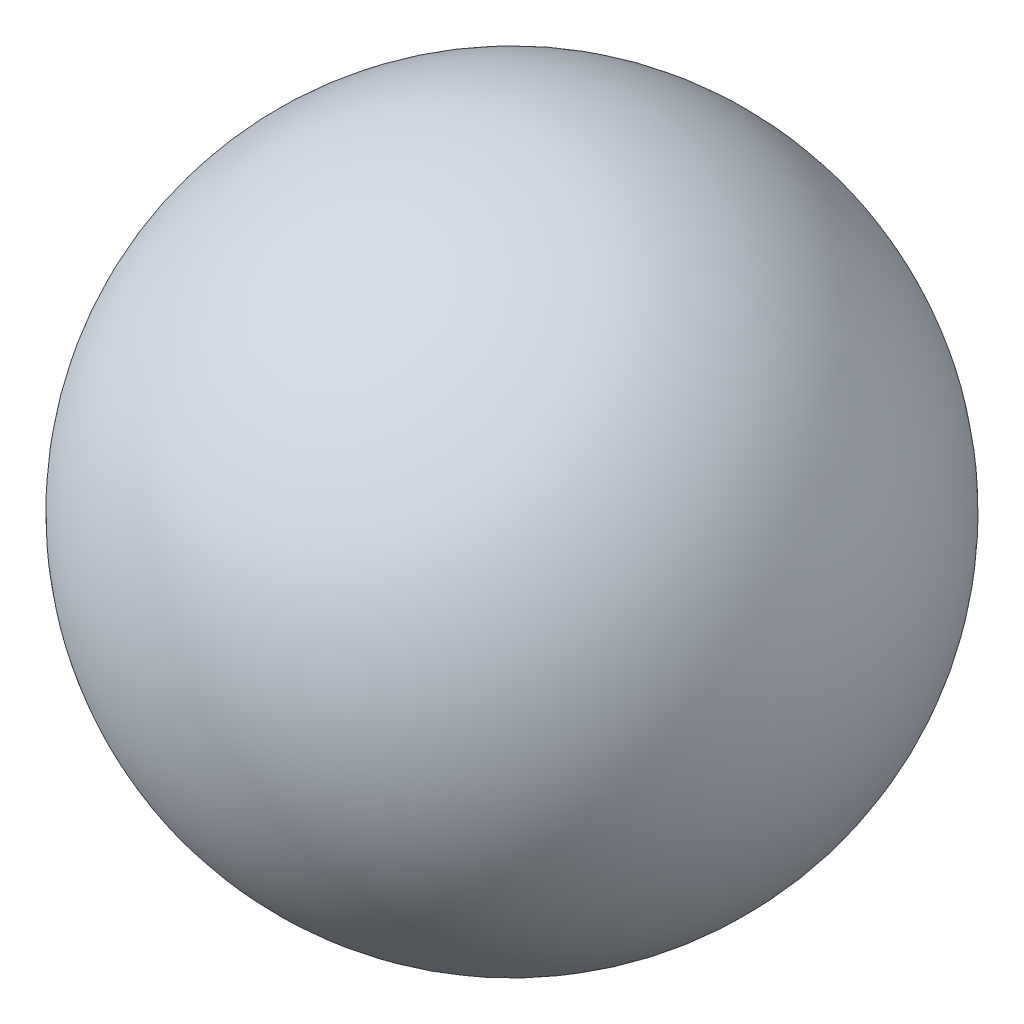
ISO-10303-21;
HEADER;
FILE_DESCRIPTION(('STEP AP214'),'2;1');
FILE_NAME('part.step','',(''),(''),'','','');
FILE_SCHEMA(('AUTOMOTIVE_DESIGN { 1 0 10303 214 1 1 1 1 }'));
ENDSEC;
DATA;
#1=APPLICATION_CONTEXT('core data for automotive mechanical design processes');
#2=APPLICATION_PROTOCOL_DEFINITION('international standard','automotive_design',2000,#1);
#3=PRODUCT_CONTEXT('',#1,'mechanical');
#4=PRODUCT('Part','Part','',(#3));
#5=PRODUCT_RELATED_PRODUCT_CATEGORY('part','',(#4));
#6=PRODUCT_DEFINITION_FORMATION('','',#4);
#7=PRODUCT_DEFINITION_CONTEXT('part definition',#1,'design');
#8=PRODUCT_DEFINITION('design','',#6,#7);
#9=PRODUCT_DEFINITION_SHAPE('','',#8);
#10=(LENGTH_UNIT() NAMED_UNIT(*) SI_UNIT(.MILLI.,.METRE.));
#11=(NAMED_UNIT(*) PLANE_ANGLE_UNIT() SI_UNIT($,.RADIAN.));
#12=(NAMED_UNIT(*) SI_UNIT($,.STERADIAN.) SOLID_ANGLE_UNIT());
#13=UNCERTAINTY_MEASURE_WITH_UNIT(LENGTH_MEASURE(1.E-05),#10,'distance_accuracy_value','');
#14=(GEOMETRIC_REPRESENTATION_CONTEXT(3) GLOBAL_UNCERTAINTY_ASSIGNED_CONTEXT((#13)) GLOBAL_UNIT_ASSIGNED_CONTEXT((#10,
#11,#12)) REPRESENTATION_CONTEXT('',''));
#15=CARTESIAN_POINT('',(0.,0.,0.));
#16=DIRECTION('',(0.,0.,1.));
#17=DIRECTION('',(1.,0.,0.));
#18=AXIS2_PLACEMENT_3D('',#15,#16,#17);
#19=CARTESIAN_POINT('',(0.,0.,0.));
#20=DIRECTION('',(0.,0.,-1.));
#21=DIRECTION('',(1.,0.,0.));
#22=AXIS2_PLACEMENT_3D('',#19,#20,#21);
#23=SPHERICAL_SURFACE('',#22,4.85649598565348);
#24=CARTESIAN_POINT('',(0.,0.,-4.85649598565348));
#25=VERTEX_POINT('',#24);
#26=VERTEX_LOOP('',#25);
#27=FACE_BOUND('',#26,.T.);
#28=ADVANCED_FACE('F26',(#27),#23,.T.);
#29=CLOSED_SHELL('',(#28));
#30=MANIFOLD_SOLID_BREP('B2',#29);
#31=ADVANCED_BREP_SHAPE_REPRESENTATION('',(#18,#30),#14);
#32=SHAPE_DEFINITION_REPRESENTATION(#9,#31);
ENDSEC;
END-ISO-10303-21;
